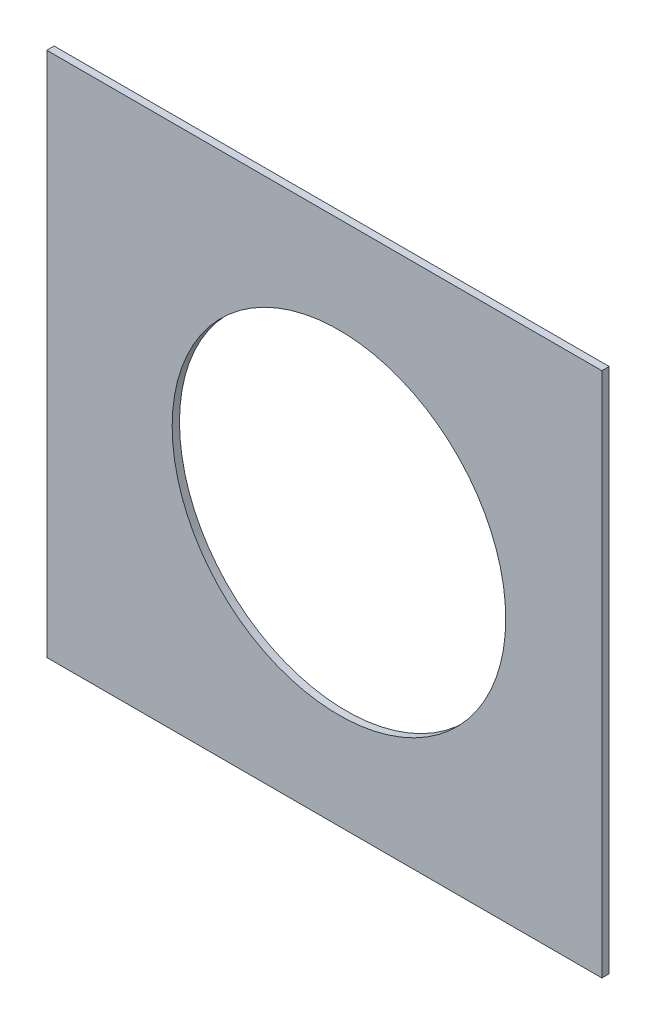
ISO-10303-21;
HEADER;
FILE_DESCRIPTION(('STEP AP214'),'2;1');
FILE_NAME('part.step','',(''),(''),'','','');
FILE_SCHEMA(('AUTOMOTIVE_DESIGN { 1 0 10303 214 1 1 1 1 }'));
ENDSEC;
DATA;
#1=APPLICATION_CONTEXT('core data for automotive mechanical design processes');
#2=APPLICATION_PROTOCOL_DEFINITION('international standard','automotive_design',2000,#1);
#3=PRODUCT_CONTEXT('',#1,'mechanical');
#4=PRODUCT('Part','Part','',(#3));
#5=PRODUCT_RELATED_PRODUCT_CATEGORY('part','',(#4));
#6=PRODUCT_DEFINITION_FORMATION('','',#4);
#7=PRODUCT_DEFINITION_CONTEXT('part definition',#1,'design');
#8=PRODUCT_DEFINITION('design','',#6,#7);
#9=PRODUCT_DEFINITION_SHAPE('','',#8);
#10=(LENGTH_UNIT() NAMED_UNIT(*) SI_UNIT(.MILLI.,.METRE.));
#11=(NAMED_UNIT(*) PLANE_ANGLE_UNIT() SI_UNIT($,.RADIAN.));
#12=(NAMED_UNIT(*) SI_UNIT($,.STERADIAN.) SOLID_ANGLE_UNIT());
#13=UNCERTAINTY_MEASURE_WITH_UNIT(LENGTH_MEASURE(1.E-05),#10,'distance_accuracy_value','');
#14=(GEOMETRIC_REPRESENTATION_CONTEXT(3) GLOBAL_UNCERTAINTY_ASSIGNED_CONTEXT((#13)) GLOBAL_UNIT_ASSIGNED_CONTEXT((#10,
#11,#12)) REPRESENTATION_CONTEXT('',''));
#15=CARTESIAN_POINT('',(0.,0.,0.));
#16=DIRECTION('',(0.,0.,1.));
#17=DIRECTION('',(1.,0.,0.));
#18=AXIS2_PLACEMENT_3D('',#15,#16,#17);
#19=CARTESIAN_POINT('',(114.3,0.,3.175));
#20=DIRECTION('',(1.,0.,0.));
#21=DIRECTION('',(0.,1.,0.));
#22=AXIS2_PLACEMENT_3D('',#19,#20,#21);
#23=PLANE('',#22);
#24=DIRECTION('',(0.,-1.,0.));
#25=VECTOR('',#24,1.);
#26=CARTESIAN_POINT('',(114.3,0.,0.));
#27=LINE('',#26,#25);
#28=CARTESIAN_POINT('',(114.3,114.3,0.));
#29=VERTEX_POINT('',#28);
#30=CARTESIAN_POINT('',(114.3,-114.3,0.));
#31=VERTEX_POINT('',#30);
#32=EDGE_CURVE('E102',#29,#31,#27,.T.);
#33=ORIENTED_EDGE('',*,*,#32,.F.);
#34=DIRECTION('',(0.,0.,-1.));
#35=VECTOR('',#34,1.);
#36=CARTESIAN_POINT('',(114.3,114.3,3.175));
#37=LINE('',#36,#35);
#38=CARTESIAN_POINT('',(114.3,114.3,3.175));
#39=VERTEX_POINT('',#38);
#40=EDGE_CURVE('E11',#39,#29,#37,.T.);
#41=ORIENTED_EDGE('',*,*,#40,.F.);
#42=DIRECTION('',(0.,-1.,0.));
#43=VECTOR('',#42,1.);
#44=CARTESIAN_POINT('',(114.3,0.,3.175));
#45=LINE('',#44,#43);
#46=CARTESIAN_POINT('',(114.3,-114.3,3.175));
#47=VERTEX_POINT('',#46);
#48=EDGE_CURVE('E93',#39,#47,#45,.T.);
#49=ORIENTED_EDGE('',*,*,#48,.T.);
#50=DIRECTION('',(0.,0.,-1.));
#51=VECTOR('',#50,1.);
#52=CARTESIAN_POINT('',(114.3,-114.3,3.175));
#53=LINE('',#52,#51);
#54=EDGE_CURVE('E73',#47,#31,#53,.T.);
#55=ORIENTED_EDGE('',*,*,#54,.T.);
#56=EDGE_LOOP('',(#33,#41,#49,#55));
#57=FACE_BOUND('',#56,.T.);
#58=ADVANCED_FACE('F35',(#57),#23,.T.);
#59=CARTESIAN_POINT('',(0.,114.3,3.175));
#60=DIRECTION('',(0.,1.,0.));
#61=DIRECTION('',(0.,0.,1.));
#62=AXIS2_PLACEMENT_3D('',#59,#60,#61);
#63=PLANE('',#62);
#64=DIRECTION('',(1.,0.,0.));
#65=VECTOR('',#64,1.);
#66=CARTESIAN_POINT('',(0.,114.3,0.));
#67=LINE('',#66,#65);
#68=CARTESIAN_POINT('',(-127.,114.3,0.));
#69=VERTEX_POINT('',#68);
#70=EDGE_CURVE('E86',#69,#29,#67,.T.);
#71=ORIENTED_EDGE('',*,*,#70,.F.);
#72=DIRECTION('',(0.,0.,-1.));
#73=VECTOR('',#72,1.);
#74=CARTESIAN_POINT('',(-127.,114.3,3.175));
#75=LINE('',#74,#73);
#76=CARTESIAN_POINT('',(-127.,114.3,3.175));
#77=VERTEX_POINT('',#76);
#78=EDGE_CURVE('E43',#77,#69,#75,.T.);
#79=ORIENTED_EDGE('',*,*,#78,.F.);
#80=DIRECTION('',(1.,0.,0.));
#81=VECTOR('',#80,1.);
#82=CARTESIAN_POINT('',(0.,114.3,3.175));
#83=LINE('',#82,#81);
#84=EDGE_CURVE('E84',#77,#39,#83,.T.);
#85=ORIENTED_EDGE('',*,*,#84,.T.);
#86=ORIENTED_EDGE('',*,*,#40,.T.);
#87=EDGE_LOOP('',(#71,#79,#85,#86));
#88=FACE_BOUND('',#87,.T.);
#89=ADVANCED_FACE('F82',(#88),#63,.T.);
#90=CARTESIAN_POINT('',(-127.,0.,3.175));
#91=DIRECTION('',(1.,0.,0.));
#92=DIRECTION('',(0.,1.,0.));
#93=AXIS2_PLACEMENT_3D('',#90,#91,#92);
#94=PLANE('',#93);
#95=DIRECTION('',(0.,-1.,0.));
#96=VECTOR('',#95,1.);
#97=CARTESIAN_POINT('',(-127.,0.,0.));
#98=LINE('',#97,#96);
#99=CARTESIAN_POINT('',(-127.,-114.3,0.));
#100=VERTEX_POINT('',#99);
#101=EDGE_CURVE('E66',#69,#100,#98,.T.);
#102=ORIENTED_EDGE('',*,*,#101,.T.);
#103=DIRECTION('',(0.,0.,-1.));
#104=VECTOR('',#103,1.);
#105=CARTESIAN_POINT('',(-127.,-114.3,3.175));
#106=LINE('',#105,#104);
#107=CARTESIAN_POINT('',(-127.,-114.3,3.175));
#108=VERTEX_POINT('',#107);
#109=EDGE_CURVE('E87',#108,#100,#106,.T.);
#110=ORIENTED_EDGE('',*,*,#109,.F.);
#111=DIRECTION('',(0.,-1.,0.));
#112=VECTOR('',#111,1.);
#113=CARTESIAN_POINT('',(-127.,0.,3.175));
#114=LINE('',#113,#112);
#115=EDGE_CURVE('E88',#77,#108,#114,.T.);
#116=ORIENTED_EDGE('',*,*,#115,.F.);
#117=ORIENTED_EDGE('',*,*,#78,.T.);
#118=EDGE_LOOP('',(#102,#110,#116,#117));
#119=FACE_BOUND('',#118,.T.);
#120=ADVANCED_FACE('F89',(#119),#94,.F.);
#121=CARTESIAN_POINT('',(0.,-114.3,3.175));
#122=DIRECTION('',(0.,1.,0.));
#123=DIRECTION('',(0.,0.,1.));
#124=AXIS2_PLACEMENT_3D('',#121,#122,#123);
#125=PLANE('',#124);
#126=DIRECTION('',(1.,0.,0.));
#127=VECTOR('',#126,1.);
#128=CARTESIAN_POINT('',(0.,-114.3,0.));
#129=LINE('',#128,#127);
#130=EDGE_CURVE('E107',#100,#31,#129,.T.);
#131=ORIENTED_EDGE('',*,*,#130,.T.);
#132=ORIENTED_EDGE('',*,*,#54,.F.);
#133=DIRECTION('',(1.,0.,0.));
#134=VECTOR('',#133,1.);
#135=CARTESIAN_POINT('',(0.,-114.3,3.175));
#136=LINE('',#135,#134);
#137=EDGE_CURVE('E51',#108,#47,#136,.T.);
#138=ORIENTED_EDGE('',*,*,#137,.F.);
#139=ORIENTED_EDGE('',*,*,#109,.T.);
#140=EDGE_LOOP('',(#131,#132,#138,#139));
#141=FACE_BOUND('',#140,.T.);
#142=ADVANCED_FACE('F114',(#141),#125,.F.);
#143=CARTESIAN_POINT('',(0.,0.,3.175));
#144=DIRECTION('',(0.,0.,-1.));
#145=DIRECTION('',(-1.,0.,0.));
#146=AXIS2_PLACEMENT_3D('',#143,#144,#145);
#147=CYLINDRICAL_SURFACE('',#146,72.5);
#148=CARTESIAN_POINT('',(0.,0.,3.175));
#149=DIRECTION('',(0.,0.,1.));
#150=DIRECTION('',(1.,0.,0.));
#151=AXIS2_PLACEMENT_3D('',#148,#149,#150);
#152=CIRCLE('',#151,72.5);
#153=CARTESIAN_POINT('',(72.5,0.,3.175));
#154=VERTEX_POINT('',#153);
#155=EDGE_CURVE('E99',#154,#154,#152,.T.);
#156=ORIENTED_EDGE('',*,*,#155,.T.);
#157=EDGE_LOOP('',(#156));
#158=FACE_BOUND('',#157,.T.);
#159=CARTESIAN_POINT('',(0.,0.,0.));
#160=DIRECTION('',(0.,0.,1.));
#161=DIRECTION('',(1.,0.,0.));
#162=AXIS2_PLACEMENT_3D('',#159,#160,#161);
#163=CIRCLE('',#162,72.5);
#164=CARTESIAN_POINT('',(72.5,0.,0.));
#165=VERTEX_POINT('',#164);
#166=EDGE_CURVE('E95',#165,#165,#163,.T.);
#167=ORIENTED_EDGE('',*,*,#166,.F.);
#168=EDGE_LOOP('',(#167));
#169=FACE_BOUND('',#168,.T.);
#170=ADVANCED_FACE('F129',(#158,#169),#147,.F.);
#171=CARTESIAN_POINT('',(0.,0.,3.175));
#172=DIRECTION('',(0.,0.,1.));
#173=DIRECTION('',(1.,0.,0.));
#174=AXIS2_PLACEMENT_3D('',#171,#172,#173);
#175=PLANE('',#174);
#176=ORIENTED_EDGE('',*,*,#48,.F.);
#177=ORIENTED_EDGE('',*,*,#84,.F.);
#178=ORIENTED_EDGE('',*,*,#115,.T.);
#179=ORIENTED_EDGE('',*,*,#137,.T.);
#180=EDGE_LOOP('',(#176,#177,#178,#179));
#181=FACE_BOUND('',#180,.T.);
#182=ORIENTED_EDGE('',*,*,#155,.F.);
#183=EDGE_LOOP('',(#182));
#184=FACE_BOUND('',#183,.T.);
#185=ADVANCED_FACE('F91',(#181,#184),#175,.T.);
#186=CARTESIAN_POINT('',(0.,0.,0.));
#187=DIRECTION('',(0.,0.,1.));
#188=DIRECTION('',(1.,0.,0.));
#189=AXIS2_PLACEMENT_3D('',#186,#187,#188);
#190=PLANE('',#189);
#191=ORIENTED_EDGE('',*,*,#32,.T.);
#192=ORIENTED_EDGE('',*,*,#130,.F.);
#193=ORIENTED_EDGE('',*,*,#101,.F.);
#194=ORIENTED_EDGE('',*,*,#70,.T.);
#195=EDGE_LOOP('',(#191,#192,#193,#194));
#196=FACE_BOUND('',#195,.T.);
#197=ORIENTED_EDGE('',*,*,#166,.T.);
#198=EDGE_LOOP('',(#197));
#199=FACE_BOUND('',#198,.T.);
#200=ADVANCED_FACE('F116',(#196,#199),#190,.F.);
#201=CLOSED_SHELL('',(#58,#89,#120,#142,#170,#185,#200));
#202=MANIFOLD_SOLID_BREP('B2',#201);
#203=ADVANCED_BREP_SHAPE_REPRESENTATION('',(#18,#202),#14);
#204=SHAPE_DEFINITION_REPRESENTATION(#9,#203);
ENDSEC;
END-ISO-10303-21;
